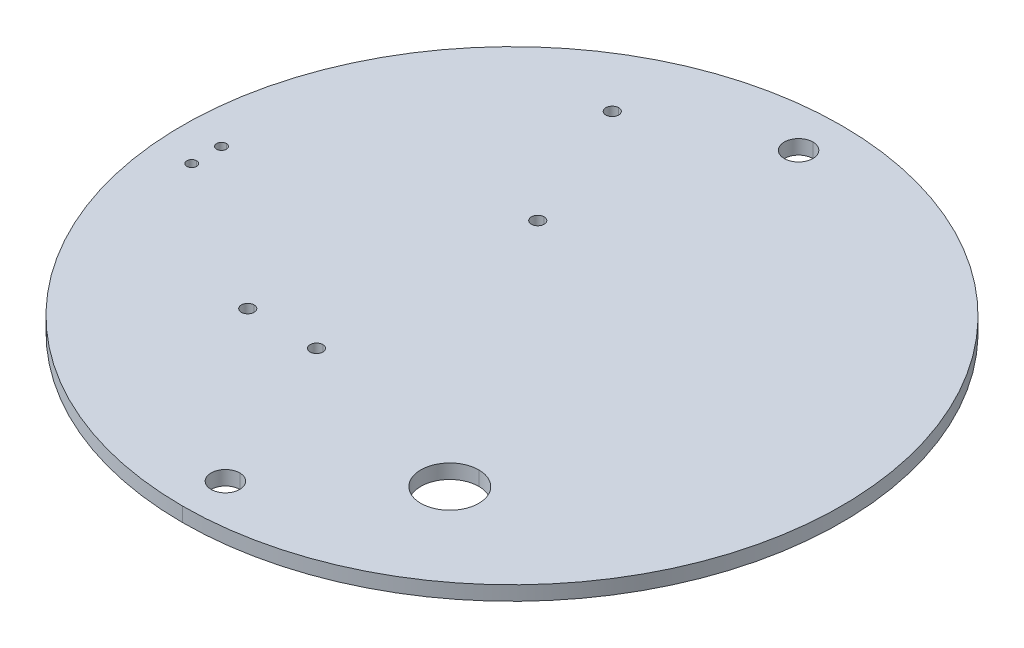
ISO-10303-21;
HEADER;
FILE_DESCRIPTION(('STEP AP214'),'2;1');
FILE_NAME('part.step','',(''),(''),'','','');
FILE_SCHEMA(('AUTOMOTIVE_DESIGN { 1 0 10303 214 1 1 1 1 }'));
ENDSEC;
DATA;
#1=APPLICATION_CONTEXT('core data for automotive mechanical design processes');
#2=APPLICATION_PROTOCOL_DEFINITION('international standard','automotive_design',2000,#1);
#3=PRODUCT_CONTEXT('',#1,'mechanical');
#4=PRODUCT('Part','Part','',(#3));
#5=PRODUCT_RELATED_PRODUCT_CATEGORY('part','',(#4));
#6=PRODUCT_DEFINITION_FORMATION('','',#4);
#7=PRODUCT_DEFINITION_CONTEXT('part definition',#1,'design');
#8=PRODUCT_DEFINITION('design','',#6,#7);
#9=PRODUCT_DEFINITION_SHAPE('','',#8);
#10=(LENGTH_UNIT() NAMED_UNIT(*) SI_UNIT(.MILLI.,.METRE.));
#11=(NAMED_UNIT(*) PLANE_ANGLE_UNIT() SI_UNIT($,.RADIAN.));
#12=(NAMED_UNIT(*) SI_UNIT($,.STERADIAN.) SOLID_ANGLE_UNIT());
#13=UNCERTAINTY_MEASURE_WITH_UNIT(LENGTH_MEASURE(1.E-05),#10,'distance_accuracy_value','');
#14=(GEOMETRIC_REPRESENTATION_CONTEXT(3) GLOBAL_UNCERTAINTY_ASSIGNED_CONTEXT((#13)) GLOBAL_UNIT_ASSIGNED_CONTEXT((#10,
#11,#12)) REPRESENTATION_CONTEXT('',''));
#15=CARTESIAN_POINT('',(0.,0.,0.));
#16=DIRECTION('',(0.,0.,1.));
#17=DIRECTION('',(1.,0.,0.));
#18=AXIS2_PLACEMENT_3D('',#15,#16,#17);
#19=CARTESIAN_POINT('',(25.8989980793946,0.,39.6789875563172));
#20=DIRECTION('',(0.,1.,0.));
#21=DIRECTION('',(0.,0.,1.));
#22=AXIS2_PLACEMENT_3D('',#19,#20,#21);
#23=CYLINDRICAL_SURFACE('',#22,6.42264793877827);
#24=DIRECTION('',(0.,1.,0.));
#25=VECTOR('',#24,1.);
#26=CARTESIAN_POINT('',(25.8989980793946,0.,33.2563396175388));
#27=LINE('',#26,#25);
#28=CARTESIAN_POINT('',(25.8989980793946,0.,33.2563396175388));
#29=VERTEX_POINT('',#28);
#30=CARTESIAN_POINT('',(25.8989980793946,3.175,33.2563396175388));
#31=VERTEX_POINT('',#30);
#32=EDGE_CURVE('E317',#29,#31,#27,.T.);
#33=ORIENTED_EDGE('',*,*,#32,.F.);
#34=CARTESIAN_POINT('',(25.8989980793946,0.,39.6789875563172));
#35=DIRECTION('',(0.,1.,0.));
#36=DIRECTION('',(0.,0.,1.));
#37=AXIS2_PLACEMENT_3D('',#34,#35,#36);
#38=CIRCLE('',#37,6.42264793877827);
#39=CARTESIAN_POINT('',(25.8989980793946,0.,46.1016354950954));
#40=VERTEX_POINT('',#39);
#41=EDGE_CURVE('E263',#40,#29,#38,.T.);
#42=ORIENTED_EDGE('',*,*,#41,.F.);
#43=DIRECTION('',(0.,1.,0.));
#44=VECTOR('',#43,1.);
#45=CARTESIAN_POINT('',(25.8989980793946,0.,46.1016354950954));
#46=LINE('',#45,#44);
#47=CARTESIAN_POINT('',(25.8989980793946,3.175,46.1016354950954));
#48=VERTEX_POINT('',#47);
#49=EDGE_CURVE('E324',#40,#48,#46,.T.);
#50=ORIENTED_EDGE('',*,*,#49,.T.);
#51=CARTESIAN_POINT('',(25.8989980793946,3.175,39.6789875563172));
#52=DIRECTION('',(0.,1.,0.));
#53=DIRECTION('',(0.,0.,1.));
#54=AXIS2_PLACEMENT_3D('',#51,#52,#53);
#55=CIRCLE('',#54,6.42264793877827);
#56=EDGE_CURVE('E332',#48,#31,#55,.T.);
#57=ORIENTED_EDGE('',*,*,#56,.T.);
#58=EDGE_LOOP('',(#33,#42,#50,#57));
#59=FACE_BOUND('',#58,.T.);
#60=ADVANCED_FACE('F16',(#59),#23,.F.);
#61=CARTESIAN_POINT('',(-28.106531802873,0.,-50.3231506884678));
#62=DIRECTION('',(0.,1.,0.));
#63=DIRECTION('',(0.,0.,1.));
#64=AXIS2_PLACEMENT_3D('',#61,#62,#63);
#65=CYLINDRICAL_SURFACE('',#64,1.4224);
#66=DIRECTION('',(0.,1.,0.));
#67=VECTOR('',#66,1.);
#68=CARTESIAN_POINT('',(-28.106531802873,0.,-51.7455506884678));
#69=LINE('',#68,#67);
#70=CARTESIAN_POINT('',(-28.106531802873,0.,-51.7455506884678));
#71=VERTEX_POINT('',#70);
#72=CARTESIAN_POINT('',(-28.106531802873,3.175,-51.7455506884678));
#73=VERTEX_POINT('',#72);
#74=EDGE_CURVE('E348',#71,#73,#69,.T.);
#75=ORIENTED_EDGE('',*,*,#74,.F.);
#76=CARTESIAN_POINT('',(-28.106531802873,0.,-50.3231506884678));
#77=DIRECTION('',(0.,1.,0.));
#78=DIRECTION('',(0.,0.,1.));
#79=AXIS2_PLACEMENT_3D('',#76,#77,#78);
#80=CIRCLE('',#79,1.4224);
#81=CARTESIAN_POINT('',(-28.106531802873,0.,-48.9007506884678));
#82=VERTEX_POINT('',#81);
#83=EDGE_CURVE('E267',#82,#71,#80,.T.);
#84=ORIENTED_EDGE('',*,*,#83,.F.);
#85=DIRECTION('',(0.,1.,0.));
#86=VECTOR('',#85,1.);
#87=CARTESIAN_POINT('',(-28.106531802873,0.,-48.9007506884678));
#88=LINE('',#87,#86);
#89=CARTESIAN_POINT('',(-28.106531802873,3.175,-48.9007506884678));
#90=VERTEX_POINT('',#89);
#91=EDGE_CURVE('E269',#82,#90,#88,.T.);
#92=ORIENTED_EDGE('',*,*,#91,.T.);
#93=CARTESIAN_POINT('',(-28.106531802873,3.175,-50.3231506884678));
#94=DIRECTION('',(0.,1.,0.));
#95=DIRECTION('',(0.,0.,1.));
#96=AXIS2_PLACEMENT_3D('',#93,#94,#95);
#97=CIRCLE('',#96,1.4224);
#98=EDGE_CURVE('E354',#90,#73,#97,.T.);
#99=ORIENTED_EDGE('',*,*,#98,.T.);
#100=EDGE_LOOP('',(#75,#84,#92,#99));
#101=FACE_BOUND('',#100,.T.);
#102=ADVANCED_FACE('F441',(#101),#65,.F.);
#103=CARTESIAN_POINT('',(-15.4065318028729,0.,-21.1131506884678));
#104=DIRECTION('',(0.,1.,0.));
#105=DIRECTION('',(0.,0.,1.));
#106=AXIS2_PLACEMENT_3D('',#103,#104,#105);
#107=CYLINDRICAL_SURFACE('',#106,1.4224);
#108=DIRECTION('',(0.,1.,0.));
#109=VECTOR('',#108,1.);
#110=CARTESIAN_POINT('',(-15.4065318028729,0.,-22.5355506884678));
#111=LINE('',#110,#109);
#112=CARTESIAN_POINT('',(-15.4065318028729,0.,-22.5355506884678));
#113=VERTEX_POINT('',#112);
#114=CARTESIAN_POINT('',(-15.4065318028729,3.175,-22.5355506884678));
#115=VERTEX_POINT('',#114);
#116=EDGE_CURVE('E235',#113,#115,#111,.T.);
#117=ORIENTED_EDGE('',*,*,#116,.F.);
#118=CARTESIAN_POINT('',(-15.4065318028729,0.,-21.1131506884678));
#119=DIRECTION('',(0.,1.,0.));
#120=DIRECTION('',(0.,0.,1.));
#121=AXIS2_PLACEMENT_3D('',#118,#119,#120);
#122=CIRCLE('',#121,1.4224);
#123=CARTESIAN_POINT('',(-15.4065318028729,0.,-19.6907506884678));
#124=VERTEX_POINT('',#123);
#125=EDGE_CURVE('E294',#124,#113,#122,.T.);
#126=ORIENTED_EDGE('',*,*,#125,.F.);
#127=DIRECTION('',(0.,1.,0.));
#128=VECTOR('',#127,1.);
#129=CARTESIAN_POINT('',(-15.4065318028729,0.,-19.6907506884678));
#130=LINE('',#129,#128);
#131=CARTESIAN_POINT('',(-15.4065318028729,3.175,-19.6907506884678));
#132=VERTEX_POINT('',#131);
#133=EDGE_CURVE('E220',#124,#132,#130,.T.);
#134=ORIENTED_EDGE('',*,*,#133,.T.);
#135=CARTESIAN_POINT('',(-15.4065318028729,3.175,-21.1131506884678));
#136=DIRECTION('',(0.,1.,0.));
#137=DIRECTION('',(0.,0.,1.));
#138=AXIS2_PLACEMENT_3D('',#135,#136,#137);
#139=CIRCLE('',#138,1.4224);
#140=EDGE_CURVE('E203',#132,#115,#139,.T.);
#141=ORIENTED_EDGE('',*,*,#140,.T.);
#142=EDGE_LOOP('',(#117,#126,#134,#141));
#143=FACE_BOUND('',#142,.T.);
#144=ADVANCED_FACE('F765',(#143),#107,.F.);
#145=CARTESIAN_POINT('',(-15.4065318028729,0.,27.9088493115323));
#146=DIRECTION('',(0.,1.,0.));
#147=DIRECTION('',(0.,0.,1.));
#148=AXIS2_PLACEMENT_3D('',#145,#146,#147);
#149=CYLINDRICAL_SURFACE('',#148,1.4224);
#150=DIRECTION('',(0.,1.,0.));
#151=VECTOR('',#150,1.);
#152=CARTESIAN_POINT('',(-15.4065318028729,0.,26.4864493115323));
#153=LINE('',#152,#151);
#154=CARTESIAN_POINT('',(-15.4065318028729,0.,26.4864493115323));
#155=VERTEX_POINT('',#154);
#156=CARTESIAN_POINT('',(-15.4065318028729,3.175,26.4864493115323));
#157=VERTEX_POINT('',#156);
#158=EDGE_CURVE('E195',#155,#157,#153,.T.);
#159=ORIENTED_EDGE('',*,*,#158,.F.);
#160=CARTESIAN_POINT('',(-15.4065318028729,0.,27.9088493115323));
#161=DIRECTION('',(0.,1.,0.));
#162=DIRECTION('',(0.,0.,1.));
#163=AXIS2_PLACEMENT_3D('',#160,#161,#162);
#164=CIRCLE('',#163,1.4224);
#165=CARTESIAN_POINT('',(-15.4065318028729,0.,29.3312493115323));
#166=VERTEX_POINT('',#165);
#167=EDGE_CURVE('E291',#166,#155,#164,.T.);
#168=ORIENTED_EDGE('',*,*,#167,.F.);
#169=DIRECTION('',(0.,1.,0.));
#170=VECTOR('',#169,1.);
#171=CARTESIAN_POINT('',(-15.4065318028729,0.,29.3312493115323));
#172=LINE('',#171,#170);
#173=CARTESIAN_POINT('',(-15.4065318028729,3.175,29.3312493115323));
#174=VERTEX_POINT('',#173);
#175=EDGE_CURVE('E198',#166,#174,#172,.T.);
#176=ORIENTED_EDGE('',*,*,#175,.T.);
#177=CARTESIAN_POINT('',(-15.4065318028729,3.175,27.9088493115323));
#178=DIRECTION('',(0.,1.,0.));
#179=DIRECTION('',(0.,0.,1.));
#180=AXIS2_PLACEMENT_3D('',#177,#178,#179);
#181=CIRCLE('',#180,1.4224);
#182=EDGE_CURVE('E192',#174,#157,#181,.T.);
#183=ORIENTED_EDGE('',*,*,#182,.T.);
#184=EDGE_LOOP('',(#159,#168,#176,#183));
#185=FACE_BOUND('',#184,.T.);
#186=ADVANCED_FACE('F18',(#185),#149,.F.);
#187=CARTESIAN_POINT('',(-30.6465318028729,0.,27.9088493115323));
#188=DIRECTION('',(0.,1.,0.));
#189=DIRECTION('',(0.,0.,1.));
#190=AXIS2_PLACEMENT_3D('',#187,#188,#189);
#191=CYLINDRICAL_SURFACE('',#190,1.4224);
#192=DIRECTION('',(0.,1.,0.));
#193=VECTOR('',#192,1.);
#194=CARTESIAN_POINT('',(-30.6465318028729,0.,26.4864493115323));
#195=LINE('',#194,#193);
#196=CARTESIAN_POINT('',(-30.6465318028729,0.,26.4864493115323));
#197=VERTEX_POINT('',#196);
#198=CARTESIAN_POINT('',(-30.6465318028729,3.175,26.4864493115323));
#199=VERTEX_POINT('',#198);
#200=EDGE_CURVE('E358',#197,#199,#195,.T.);
#201=ORIENTED_EDGE('',*,*,#200,.F.);
#202=CARTESIAN_POINT('',(-30.6465318028729,0.,27.9088493115323));
#203=DIRECTION('',(0.,1.,0.));
#204=DIRECTION('',(0.,0.,1.));
#205=AXIS2_PLACEMENT_3D('',#202,#203,#204);
#206=CIRCLE('',#205,1.4224);
#207=CARTESIAN_POINT('',(-30.6465318028729,0.,29.3312493115323));
#208=VERTEX_POINT('',#207);
#209=EDGE_CURVE('E293',#208,#197,#206,.T.);
#210=ORIENTED_EDGE('',*,*,#209,.F.);
#211=DIRECTION('',(0.,1.,0.));
#212=VECTOR('',#211,1.);
#213=CARTESIAN_POINT('',(-30.6465318028729,0.,29.3312493115323));
#214=LINE('',#213,#212);
#215=CARTESIAN_POINT('',(-30.6465318028729,3.175,29.3312493115323));
#216=VERTEX_POINT('',#215);
#217=EDGE_CURVE('E257',#208,#216,#214,.T.);
#218=ORIENTED_EDGE('',*,*,#217,.T.);
#219=CARTESIAN_POINT('',(-30.6465318028729,3.175,27.9088493115323));
#220=DIRECTION('',(0.,1.,0.));
#221=DIRECTION('',(0.,0.,1.));
#222=AXIS2_PLACEMENT_3D('',#219,#220,#221);
#223=CIRCLE('',#222,1.4224);
#224=EDGE_CURVE('E202',#216,#199,#223,.T.);
#225=ORIENTED_EDGE('',*,*,#224,.T.);
#226=EDGE_LOOP('',(#201,#210,#218,#225));
#227=FACE_BOUND('',#226,.T.);
#228=ADVANCED_FACE('F786',(#227),#191,.F.);
#229=CARTESIAN_POINT('',(-64.676376723412,0.,-0.314808657817677));
#230=DIRECTION('',(0.,1.,0.));
#231=DIRECTION('',(0.,0.,1.));
#232=AXIS2_PLACEMENT_3D('',#229,#230,#231);
#233=CYLINDRICAL_SURFACE('',#232,1.0922);
#234=DIRECTION('',(0.,1.,0.));
#235=VECTOR('',#234,1.);
#236=CARTESIAN_POINT('',(-64.676376723412,0.,-1.40700865781768));
#237=LINE('',#236,#235);
#238=CARTESIAN_POINT('',(-64.676376723412,0.,-1.40700865781768));
#239=VERTEX_POINT('',#238);
#240=CARTESIAN_POINT('',(-64.676376723412,3.175,-1.40700865781768));
#241=VERTEX_POINT('',#240);
#242=EDGE_CURVE('E306',#239,#241,#237,.T.);
#243=ORIENTED_EDGE('',*,*,#242,.F.);
#244=CARTESIAN_POINT('',(-64.676376723412,0.,-0.314808657817677));
#245=DIRECTION('',(0.,1.,0.));
#246=DIRECTION('',(0.,0.,1.));
#247=AXIS2_PLACEMENT_3D('',#244,#245,#246);
#248=CIRCLE('',#247,1.0922);
#249=CARTESIAN_POINT('',(-64.676376723412,0.,0.777391342182322));
#250=VERTEX_POINT('',#249);
#251=EDGE_CURVE('E312',#250,#239,#248,.T.);
#252=ORIENTED_EDGE('',*,*,#251,.F.);
#253=DIRECTION('',(0.,1.,0.));
#254=VECTOR('',#253,1.);
#255=CARTESIAN_POINT('',(-64.676376723412,0.,0.777391342182322));
#256=LINE('',#255,#254);
#257=CARTESIAN_POINT('',(-64.676376723412,3.175,0.777391342182322));
#258=VERTEX_POINT('',#257);
#259=EDGE_CURVE('E281',#250,#258,#256,.T.);
#260=ORIENTED_EDGE('',*,*,#259,.T.);
#261=CARTESIAN_POINT('',(-64.676376723412,3.175,-0.314808657817677));
#262=DIRECTION('',(0.,1.,0.));
#263=DIRECTION('',(0.,0.,1.));
#264=AXIS2_PLACEMENT_3D('',#261,#262,#263);
#265=CIRCLE('',#264,1.0922);
#266=EDGE_CURVE('E277',#258,#241,#265,.T.);
#267=ORIENTED_EDGE('',*,*,#266,.T.);
#268=EDGE_LOOP('',(#243,#252,#260,#267));
#269=FACE_BOUND('',#268,.T.);
#270=ADVANCED_FACE('F421',(#269),#233,.F.);
#271=CARTESIAN_POINT('',(-64.676376723412,0.,6.28919134218232));
#272=DIRECTION('',(0.,1.,0.));
#273=DIRECTION('',(0.,0.,1.));
#274=AXIS2_PLACEMENT_3D('',#271,#272,#273);
#275=CYLINDRICAL_SURFACE('',#274,1.0922);
#276=DIRECTION('',(0.,1.,0.));
#277=VECTOR('',#276,1.);
#278=CARTESIAN_POINT('',(-64.676376723412,0.,5.19699134218232));
#279=LINE('',#278,#277);
#280=CARTESIAN_POINT('',(-64.676376723412,0.,5.19699134218232));
#281=VERTEX_POINT('',#280);
#282=CARTESIAN_POINT('',(-64.676376723412,3.175,5.19699134218232));
#283=VERTEX_POINT('',#282);
#284=EDGE_CURVE('E245',#281,#283,#279,.T.);
#285=ORIENTED_EDGE('',*,*,#284,.F.);
#286=CARTESIAN_POINT('',(-64.676376723412,0.,6.28919134218232));
#287=DIRECTION('',(0.,1.,0.));
#288=DIRECTION('',(0.,0.,1.));
#289=AXIS2_PLACEMENT_3D('',#286,#287,#288);
#290=CIRCLE('',#289,1.0922);
#291=CARTESIAN_POINT('',(-64.676376723412,0.,7.38139134218232));
#292=VERTEX_POINT('',#291);
#293=EDGE_CURVE('E244',#292,#281,#290,.T.);
#294=ORIENTED_EDGE('',*,*,#293,.F.);
#295=DIRECTION('',(0.,1.,0.));
#296=VECTOR('',#295,1.);
#297=CARTESIAN_POINT('',(-64.676376723412,0.,7.38139134218232));
#298=LINE('',#297,#296);
#299=CARTESIAN_POINT('',(-64.676376723412,3.175,7.38139134218232));
#300=VERTEX_POINT('',#299);
#301=EDGE_CURVE('E256',#292,#300,#298,.T.);
#302=ORIENTED_EDGE('',*,*,#301,.T.);
#303=CARTESIAN_POINT('',(-64.676376723412,3.175,6.28919134218232));
#304=DIRECTION('',(0.,1.,0.));
#305=DIRECTION('',(0.,0.,1.));
#306=AXIS2_PLACEMENT_3D('',#303,#304,#305);
#307=CIRCLE('',#306,1.0922);
#308=EDGE_CURVE('E282',#300,#283,#307,.T.);
#309=ORIENTED_EDGE('',*,*,#308,.T.);
#310=EDGE_LOOP('',(#285,#294,#302,#309));
#311=FACE_BOUND('',#310,.T.);
#312=ADVANCED_FACE('F778',(#311),#275,.F.);
#313=CARTESIAN_POINT('',(0.,0.,63.5));
#314=DIRECTION('',(0.,1.,0.));
#315=DIRECTION('',(0.,0.,1.));
#316=AXIS2_PLACEMENT_3D('',#313,#314,#315);
#317=CYLINDRICAL_SURFACE('',#316,3.175);
#318=DIRECTION('',(0.,1.,0.));
#319=VECTOR('',#318,1.);
#320=CARTESIAN_POINT('',(0.,0.,60.325));
#321=LINE('',#320,#319);
#322=CARTESIAN_POINT('',(0.,0.,60.325));
#323=VERTEX_POINT('',#322);
#324=CARTESIAN_POINT('',(0.,3.175,60.325));
#325=VERTEX_POINT('',#324);
#326=EDGE_CURVE('E255',#323,#325,#321,.T.);
#327=ORIENTED_EDGE('',*,*,#326,.F.);
#328=CARTESIAN_POINT('',(0.,0.,63.5));
#329=DIRECTION('',(0.,1.,0.));
#330=DIRECTION('',(0.,0.,1.));
#331=AXIS2_PLACEMENT_3D('',#328,#329,#330);
#332=CIRCLE('',#331,3.175);
#333=CARTESIAN_POINT('',(0.,0.,66.675));
#334=VERTEX_POINT('',#333);
#335=EDGE_CURVE('E27',#334,#323,#332,.T.);
#336=ORIENTED_EDGE('',*,*,#335,.F.);
#337=DIRECTION('',(0.,1.,0.));
#338=VECTOR('',#337,1.);
#339=CARTESIAN_POINT('',(0.,0.,66.675));
#340=LINE('',#339,#338);
#341=CARTESIAN_POINT('',(0.,3.175,66.675));
#342=VERTEX_POINT('',#341);
#343=EDGE_CURVE('E20',#334,#342,#340,.T.);
#344=ORIENTED_EDGE('',*,*,#343,.T.);
#345=CARTESIAN_POINT('',(0.,3.175,63.5));
#346=DIRECTION('',(0.,1.,0.));
#347=DIRECTION('',(0.,0.,1.));
#348=AXIS2_PLACEMENT_3D('',#345,#346,#347);
#349=CIRCLE('',#348,3.175);
#350=EDGE_CURVE('E285',#342,#325,#349,.T.);
#351=ORIENTED_EDGE('',*,*,#350,.T.);
#352=EDGE_LOOP('',(#327,#336,#344,#351));
#353=FACE_BOUND('',#352,.T.);
#354=ADVANCED_FACE('F774',(#353),#317,.F.);
#355=CARTESIAN_POINT('',(4.43418130033078E-13,0.,-63.5));
#356=DIRECTION('',(0.,1.,0.));
#357=DIRECTION('',(0.,0.,1.));
#358=AXIS2_PLACEMENT_3D('',#355,#356,#357);
#359=CYLINDRICAL_SURFACE('',#358,3.175);
#360=DIRECTION('',(0.,1.,0.));
#361=VECTOR('',#360,1.);
#362=CARTESIAN_POINT('',(4.43806955391807E-13,0.,-66.675));
#363=LINE('',#362,#361);
#364=CARTESIAN_POINT('',(4.43806955391807E-13,0.,-66.675));
#365=VERTEX_POINT('',#364);
#366=CARTESIAN_POINT('',(4.43806955391807E-13,3.175,-66.675));
#367=VERTEX_POINT('',#366);
#368=EDGE_CURVE('E229',#365,#367,#363,.T.);
#369=ORIENTED_EDGE('',*,*,#368,.F.);
#370=CARTESIAN_POINT('',(4.43418130033078E-13,0.,-63.5));
#371=DIRECTION('',(0.,1.,0.));
#372=DIRECTION('',(0.,0.,1.));
#373=AXIS2_PLACEMENT_3D('',#370,#371,#372);
#374=CIRCLE('',#373,3.175);
#375=CARTESIAN_POINT('',(4.43418130033078E-13,0.,-60.325));
#376=VERTEX_POINT('',#375);
#377=EDGE_CURVE('E11',#376,#365,#374,.T.);
#378=ORIENTED_EDGE('',*,*,#377,.F.);
#379=DIRECTION('',(0.,1.,0.));
#380=VECTOR('',#379,1.);
#381=CARTESIAN_POINT('',(4.43418130033078E-13,0.,-60.325));
#382=LINE('',#381,#380);
#383=CARTESIAN_POINT('',(4.43418130033078E-13,3.175,-60.325));
#384=VERTEX_POINT('',#383);
#385=EDGE_CURVE('E290',#376,#384,#382,.T.);
#386=ORIENTED_EDGE('',*,*,#385,.T.);
#387=CARTESIAN_POINT('',(4.43418130033078E-13,3.175,-63.5));
#388=DIRECTION('',(0.,1.,0.));
#389=DIRECTION('',(0.,0.,1.));
#390=AXIS2_PLACEMENT_3D('',#387,#388,#389);
#391=CIRCLE('',#390,3.175);
#392=EDGE_CURVE('E268',#384,#367,#391,.T.);
#393=ORIENTED_EDGE('',*,*,#392,.T.);
#394=EDGE_LOOP('',(#369,#378,#386,#393));
#395=FACE_BOUND('',#394,.T.);
#396=ADVANCED_FACE('F717',(#395),#359,.F.);
#397=CARTESIAN_POINT('',(0.,0.,0.));
#398=DIRECTION('',(0.,1.,0.));
#399=DIRECTION('',(1.,0.,0.));
#400=AXIS2_PLACEMENT_3D('',#397,#398,#399);
#401=PLANE('',#400);
#402=ORIENTED_EDGE('',*,*,#377,.T.);
#403=CARTESIAN_POINT('',(4.43418130033078E-13,0.,-63.5));
#404=DIRECTION('',(0.,1.,0.));
#405=DIRECTION('',(0.,0.,1.));
#406=AXIS2_PLACEMENT_3D('',#403,#404,#405);
#407=CIRCLE('',#406,3.175);
#408=EDGE_CURVE('E226',#365,#376,#407,.T.);
#409=ORIENTED_EDGE('',*,*,#408,.T.);
#410=EDGE_LOOP('',(#402,#409));
#411=FACE_BOUND('',#410,.T.);
#412=ORIENTED_EDGE('',*,*,#335,.T.);
#413=CARTESIAN_POINT('',(0.,0.,63.5));
#414=DIRECTION('',(0.,1.,0.));
#415=DIRECTION('',(0.,0.,1.));
#416=AXIS2_PLACEMENT_3D('',#413,#414,#415);
#417=CIRCLE('',#416,3.175);
#418=EDGE_CURVE('E251',#323,#334,#417,.T.);
#419=ORIENTED_EDGE('',*,*,#418,.T.);
#420=EDGE_LOOP('',(#412,#419));
#421=FACE_BOUND('',#420,.T.);
#422=ORIENTED_EDGE('',*,*,#293,.T.);
#423=CARTESIAN_POINT('',(-64.676376723412,0.,6.28919134218232));
#424=DIRECTION('',(0.,1.,0.));
#425=DIRECTION('',(0.,0.,1.));
#426=AXIS2_PLACEMENT_3D('',#423,#424,#425);
#427=CIRCLE('',#426,1.0922);
#428=EDGE_CURVE('E250',#281,#292,#427,.T.);
#429=ORIENTED_EDGE('',*,*,#428,.T.);
#430=EDGE_LOOP('',(#422,#429));
#431=FACE_BOUND('',#430,.T.);
#432=ORIENTED_EDGE('',*,*,#251,.T.);
#433=CARTESIAN_POINT('',(-64.676376723412,0.,-0.314808657817677));
#434=DIRECTION('',(0.,1.,0.));
#435=DIRECTION('',(0.,0.,1.));
#436=AXIS2_PLACEMENT_3D('',#433,#434,#435);
#437=CIRCLE('',#436,1.0922);
#438=EDGE_CURVE('E261',#239,#250,#437,.T.);
#439=ORIENTED_EDGE('',*,*,#438,.T.);
#440=EDGE_LOOP('',(#432,#439));
#441=FACE_BOUND('',#440,.T.);
#442=ORIENTED_EDGE('',*,*,#209,.T.);
#443=CARTESIAN_POINT('',(-30.6465318028729,0.,27.9088493115323));
#444=DIRECTION('',(0.,1.,0.));
#445=DIRECTION('',(0.,0.,1.));
#446=AXIS2_PLACEMENT_3D('',#443,#444,#445);
#447=CIRCLE('',#446,1.4224);
#448=EDGE_CURVE('E298',#197,#208,#447,.T.);
#449=ORIENTED_EDGE('',*,*,#448,.T.);
#450=EDGE_LOOP('',(#442,#449));
#451=FACE_BOUND('',#450,.T.);
#452=ORIENTED_EDGE('',*,*,#167,.T.);
#453=CARTESIAN_POINT('',(-15.4065318028729,0.,27.9088493115323));
#454=DIRECTION('',(0.,1.,0.));
#455=DIRECTION('',(0.,0.,1.));
#456=AXIS2_PLACEMENT_3D('',#453,#454,#455);
#457=CIRCLE('',#456,1.4224);
#458=EDGE_CURVE('E213',#155,#166,#457,.T.);
#459=ORIENTED_EDGE('',*,*,#458,.T.);
#460=EDGE_LOOP('',(#452,#459));
#461=FACE_BOUND('',#460,.T.);
#462=ORIENTED_EDGE('',*,*,#125,.T.);
#463=CARTESIAN_POINT('',(-15.4065318028729,0.,-21.1131506884678));
#464=DIRECTION('',(0.,1.,0.));
#465=DIRECTION('',(0.,0.,1.));
#466=AXIS2_PLACEMENT_3D('',#463,#464,#465);
#467=CIRCLE('',#466,1.4224);
#468=EDGE_CURVE('E273',#113,#124,#467,.T.);
#469=ORIENTED_EDGE('',*,*,#468,.T.);
#470=EDGE_LOOP('',(#462,#469));
#471=FACE_BOUND('',#470,.T.);
#472=ORIENTED_EDGE('',*,*,#83,.T.);
#473=CARTESIAN_POINT('',(-28.106531802873,0.,-50.3231506884678));
#474=DIRECTION('',(0.,1.,0.));
#475=DIRECTION('',(0.,0.,1.));
#476=AXIS2_PLACEMENT_3D('',#473,#474,#475);
#477=CIRCLE('',#476,1.4224);
#478=EDGE_CURVE('E224',#71,#82,#477,.T.);
#479=ORIENTED_EDGE('',*,*,#478,.T.);
#480=EDGE_LOOP('',(#472,#479));
#481=FACE_BOUND('',#480,.T.);
#482=ORIENTED_EDGE('',*,*,#41,.T.);
#483=CARTESIAN_POINT('',(25.8989980793946,0.,39.6789875563172));
#484=DIRECTION('',(0.,1.,0.));
#485=DIRECTION('',(0.,0.,1.));
#486=AXIS2_PLACEMENT_3D('',#483,#484,#485);
#487=CIRCLE('',#486,6.42264793877827);
#488=EDGE_CURVE('E313',#29,#40,#487,.T.);
#489=ORIENTED_EDGE('',*,*,#488,.T.);
#490=EDGE_LOOP('',(#482,#489));
#491=FACE_BOUND('',#490,.T.);
#492=CARTESIAN_POINT('',(0.,0.,0.));
#493=DIRECTION('',(0.,1.,0.));
#494=DIRECTION('',(0.,0.,1.));
#495=AXIS2_PLACEMENT_3D('',#492,#493,#494);
#496=CIRCLE('',#495,73.025);
#497=CARTESIAN_POINT('',(0.,0.,-73.025));
#498=VERTEX_POINT('',#497);
#499=CARTESIAN_POINT('',(0.,0.,73.025));
#500=VERTEX_POINT('',#499);
#501=EDGE_CURVE('E41',#498,#500,#496,.T.);
#502=ORIENTED_EDGE('',*,*,#501,.F.);
#503=CARTESIAN_POINT('',(0.,0.,0.));
#504=DIRECTION('',(0.,1.,0.));
#505=DIRECTION('',(0.,0.,1.));
#506=AXIS2_PLACEMENT_3D('',#503,#504,#505);
#507=CIRCLE('',#506,73.025);
#508=EDGE_CURVE('E236',#500,#498,#507,.T.);
#509=ORIENTED_EDGE('',*,*,#508,.F.);
#510=EDGE_LOOP('',(#502,#509));
#511=FACE_BOUND('',#510,.T.);
#512=ADVANCED_FACE('F720',(#411,#421,#431,#441,#451,#461,#471,#481,#491,#511),#401,.F.);
#513=CARTESIAN_POINT('',(0.,3.175,0.));
#514=DIRECTION('',(0.,1.,0.));
#515=DIRECTION('',(1.,0.,0.));
#516=AXIS2_PLACEMENT_3D('',#513,#514,#515);
#517=PLANE('',#516);
#518=ORIENTED_EDGE('',*,*,#392,.F.);
#519=CARTESIAN_POINT('',(4.43418130033078E-13,3.175,-63.5));
#520=DIRECTION('',(0.,1.,0.));
#521=DIRECTION('',(0.,0.,1.));
#522=AXIS2_PLACEMENT_3D('',#519,#520,#521);
#523=CIRCLE('',#522,3.175);
#524=EDGE_CURVE('E429',#367,#384,#523,.T.);
#525=ORIENTED_EDGE('',*,*,#524,.F.);
#526=EDGE_LOOP('',(#518,#525));
#527=FACE_BOUND('',#526,.T.);
#528=ORIENTED_EDGE('',*,*,#350,.F.);
#529=CARTESIAN_POINT('',(0.,3.175,63.5));
#530=DIRECTION('',(0.,1.,0.));
#531=DIRECTION('',(0.,0.,1.));
#532=AXIS2_PLACEMENT_3D('',#529,#530,#531);
#533=CIRCLE('',#532,3.175);
#534=EDGE_CURVE('E365',#325,#342,#533,.T.);
#535=ORIENTED_EDGE('',*,*,#534,.F.);
#536=EDGE_LOOP('',(#528,#535));
#537=FACE_BOUND('',#536,.T.);
#538=ORIENTED_EDGE('',*,*,#308,.F.);
#539=CARTESIAN_POINT('',(-64.676376723412,3.175,6.28919134218232));
#540=DIRECTION('',(0.,1.,0.));
#541=DIRECTION('',(0.,0.,1.));
#542=AXIS2_PLACEMENT_3D('',#539,#540,#541);
#543=CIRCLE('',#542,1.0922);
#544=EDGE_CURVE('E249',#283,#300,#543,.T.);
#545=ORIENTED_EDGE('',*,*,#544,.F.);
#546=EDGE_LOOP('',(#538,#545));
#547=FACE_BOUND('',#546,.T.);
#548=ORIENTED_EDGE('',*,*,#266,.F.);
#549=CARTESIAN_POINT('',(-64.676376723412,3.175,-0.314808657817677));
#550=DIRECTION('',(0.,1.,0.));
#551=DIRECTION('',(0.,0.,1.));
#552=AXIS2_PLACEMENT_3D('',#549,#550,#551);
#553=CIRCLE('',#552,1.0922);
#554=EDGE_CURVE('E302',#241,#258,#553,.T.);
#555=ORIENTED_EDGE('',*,*,#554,.F.);
#556=EDGE_LOOP('',(#548,#555));
#557=FACE_BOUND('',#556,.T.);
#558=ORIENTED_EDGE('',*,*,#224,.F.);
#559=CARTESIAN_POINT('',(-30.6465318028729,3.175,27.9088493115323));
#560=DIRECTION('',(0.,1.,0.));
#561=DIRECTION('',(0.,0.,1.));
#562=AXIS2_PLACEMENT_3D('',#559,#560,#561);
#563=CIRCLE('',#562,1.4224);
#564=EDGE_CURVE('E262',#199,#216,#563,.T.);
#565=ORIENTED_EDGE('',*,*,#564,.F.);
#566=EDGE_LOOP('',(#558,#565));
#567=FACE_BOUND('',#566,.T.);
#568=ORIENTED_EDGE('',*,*,#182,.F.);
#569=CARTESIAN_POINT('',(-15.4065318028729,3.175,27.9088493115323));
#570=DIRECTION('',(0.,1.,0.));
#571=DIRECTION('',(0.,0.,1.));
#572=AXIS2_PLACEMENT_3D('',#569,#570,#571);
#573=CIRCLE('',#572,1.4224);
#574=EDGE_CURVE('E205',#157,#174,#573,.T.);
#575=ORIENTED_EDGE('',*,*,#574,.F.);
#576=EDGE_LOOP('',(#568,#575));
#577=FACE_BOUND('',#576,.T.);
#578=ORIENTED_EDGE('',*,*,#140,.F.);
#579=CARTESIAN_POINT('',(-15.4065318028729,3.175,-21.1131506884678));
#580=DIRECTION('',(0.,1.,0.));
#581=DIRECTION('',(0.,0.,1.));
#582=AXIS2_PLACEMENT_3D('',#579,#580,#581);
#583=CIRCLE('',#582,1.4224);
#584=EDGE_CURVE('E231',#115,#132,#583,.T.);
#585=ORIENTED_EDGE('',*,*,#584,.F.);
#586=EDGE_LOOP('',(#578,#585));
#587=FACE_BOUND('',#586,.T.);
#588=ORIENTED_EDGE('',*,*,#98,.F.);
#589=CARTESIAN_POINT('',(-28.106531802873,3.175,-50.3231506884678));
#590=DIRECTION('',(0.,1.,0.));
#591=DIRECTION('',(0.,0.,1.));
#592=AXIS2_PLACEMENT_3D('',#589,#590,#591);
#593=CIRCLE('',#592,1.4224);
#594=EDGE_CURVE('E274',#73,#90,#593,.T.);
#595=ORIENTED_EDGE('',*,*,#594,.F.);
#596=EDGE_LOOP('',(#588,#595));
#597=FACE_BOUND('',#596,.T.);
#598=ORIENTED_EDGE('',*,*,#56,.F.);
#599=CARTESIAN_POINT('',(25.8989980793946,3.175,39.6789875563172));
#600=DIRECTION('',(0.,1.,0.));
#601=DIRECTION('',(0.,0.,1.));
#602=AXIS2_PLACEMENT_3D('',#599,#600,#601);
#603=CIRCLE('',#602,6.42264793877827);
#604=EDGE_CURVE('E321',#31,#48,#603,.T.);
#605=ORIENTED_EDGE('',*,*,#604,.F.);
#606=EDGE_LOOP('',(#598,#605));
#607=FACE_BOUND('',#606,.T.);
#608=CARTESIAN_POINT('',(0.,3.175,0.));
#609=DIRECTION('',(0.,1.,0.));
#610=DIRECTION('',(0.,0.,1.));
#611=AXIS2_PLACEMENT_3D('',#608,#609,#610);
#612=CIRCLE('',#611,73.025);
#613=CARTESIAN_POINT('',(0.,3.175,-73.025));
#614=VERTEX_POINT('',#613);
#615=CARTESIAN_POINT('',(0.,3.175,73.025));
#616=VERTEX_POINT('',#615);
#617=EDGE_CURVE('E303',#614,#616,#612,.T.);
#618=ORIENTED_EDGE('',*,*,#617,.T.);
#619=CARTESIAN_POINT('',(0.,3.175,0.));
#620=DIRECTION('',(0.,1.,0.));
#621=DIRECTION('',(0.,0.,1.));
#622=AXIS2_PLACEMENT_3D('',#619,#620,#621);
#623=CIRCLE('',#622,73.025);
#624=EDGE_CURVE('E286',#616,#614,#623,.T.);
#625=ORIENTED_EDGE('',*,*,#624,.T.);
#626=EDGE_LOOP('',(#618,#625));
#627=FACE_BOUND('',#626,.T.);
#628=ADVANCED_FACE('F206',(#527,#537,#547,#557,#567,#577,#587,#597,#607,#627),#517,.T.);
#629=CARTESIAN_POINT('',(0.,3.175,0.));
#630=DIRECTION('',(0.,-1.,0.));
#631=DIRECTION('',(0.,0.,-1.));
#632=AXIS2_PLACEMENT_3D('',#629,#630,#631);
#633=CYLINDRICAL_SURFACE('',#632,73.025);
#634=DIRECTION('',(0.,-1.,0.));
#635=VECTOR('',#634,1.);
#636=CARTESIAN_POINT('',(0.,3.175,73.025));
#637=LINE('',#636,#635);
#638=EDGE_CURVE('E241',#616,#500,#637,.T.);
#639=ORIENTED_EDGE('',*,*,#638,.F.);
#640=ORIENTED_EDGE('',*,*,#617,.F.);
#641=DIRECTION('',(0.,-1.,0.));
#642=VECTOR('',#641,1.);
#643=CARTESIAN_POINT('',(0.,3.175,-73.025));
#644=LINE('',#643,#642);
#645=EDGE_CURVE('E240',#614,#498,#644,.T.);
#646=ORIENTED_EDGE('',*,*,#645,.T.);
#647=ORIENTED_EDGE('',*,*,#501,.T.);
#648=EDGE_LOOP('',(#639,#640,#646,#647));
#649=FACE_BOUND('',#648,.T.);
#650=ADVANCED_FACE('F740',(#649),#633,.T.);
#651=CARTESIAN_POINT('',(0.,3.175,0.));
#652=DIRECTION('',(0.,-1.,0.));
#653=DIRECTION('',(0.,0.,-1.));
#654=AXIS2_PLACEMENT_3D('',#651,#652,#653);
#655=CYLINDRICAL_SURFACE('',#654,73.025);
#656=ORIENTED_EDGE('',*,*,#624,.F.);
#657=ORIENTED_EDGE('',*,*,#638,.T.);
#658=ORIENTED_EDGE('',*,*,#508,.T.);
#659=ORIENTED_EDGE('',*,*,#645,.F.);
#660=EDGE_LOOP('',(#656,#657,#658,#659));
#661=FACE_BOUND('',#660,.T.);
#662=ADVANCED_FACE('F747',(#661),#655,.T.);
#663=CARTESIAN_POINT('',(4.43418130033078E-13,0.,-63.5));
#664=DIRECTION('',(0.,1.,0.));
#665=DIRECTION('',(0.,0.,1.));
#666=AXIS2_PLACEMENT_3D('',#663,#664,#665);
#667=CYLINDRICAL_SURFACE('',#666,3.175);
#668=ORIENTED_EDGE('',*,*,#408,.F.);
#669=ORIENTED_EDGE('',*,*,#368,.T.);
#670=ORIENTED_EDGE('',*,*,#524,.T.);
#671=ORIENTED_EDGE('',*,*,#385,.F.);
#672=EDGE_LOOP('',(#668,#669,#670,#671));
#673=FACE_BOUND('',#672,.T.);
#674=ADVANCED_FACE('F711',(#673),#667,.F.);
#675=CARTESIAN_POINT('',(0.,0.,63.5));
#676=DIRECTION('',(0.,1.,0.));
#677=DIRECTION('',(0.,0.,1.));
#678=AXIS2_PLACEMENT_3D('',#675,#676,#677);
#679=CYLINDRICAL_SURFACE('',#678,3.175);
#680=ORIENTED_EDGE('',*,*,#418,.F.);
#681=ORIENTED_EDGE('',*,*,#326,.T.);
#682=ORIENTED_EDGE('',*,*,#534,.T.);
#683=ORIENTED_EDGE('',*,*,#343,.F.);
#684=EDGE_LOOP('',(#680,#681,#682,#683));
#685=FACE_BOUND('',#684,.T.);
#686=ADVANCED_FACE('F755',(#685),#679,.F.);
#687=CARTESIAN_POINT('',(-64.676376723412,0.,6.28919134218232));
#688=DIRECTION('',(0.,1.,0.));
#689=DIRECTION('',(0.,0.,1.));
#690=AXIS2_PLACEMENT_3D('',#687,#688,#689);
#691=CYLINDRICAL_SURFACE('',#690,1.0922);
#692=ORIENTED_EDGE('',*,*,#428,.F.);
#693=ORIENTED_EDGE('',*,*,#284,.T.);
#694=ORIENTED_EDGE('',*,*,#544,.T.);
#695=ORIENTED_EDGE('',*,*,#301,.F.);
#696=EDGE_LOOP('',(#692,#693,#694,#695));
#697=FACE_BOUND('',#696,.T.);
#698=ADVANCED_FACE('F805',(#697),#691,.F.);
#699=CARTESIAN_POINT('',(-64.676376723412,0.,-0.314808657817677));
#700=DIRECTION('',(0.,1.,0.));
#701=DIRECTION('',(0.,0.,1.));
#702=AXIS2_PLACEMENT_3D('',#699,#700,#701);
#703=CYLINDRICAL_SURFACE('',#702,1.0922);
#704=ORIENTED_EDGE('',*,*,#438,.F.);
#705=ORIENTED_EDGE('',*,*,#242,.T.);
#706=ORIENTED_EDGE('',*,*,#554,.T.);
#707=ORIENTED_EDGE('',*,*,#259,.F.);
#708=EDGE_LOOP('',(#704,#705,#706,#707));
#709=FACE_BOUND('',#708,.T.);
#710=ADVANCED_FACE('F416',(#709),#703,.F.);
#711=CARTESIAN_POINT('',(-30.6465318028729,0.,27.9088493115323));
#712=DIRECTION('',(0.,1.,0.));
#713=DIRECTION('',(0.,0.,1.));
#714=AXIS2_PLACEMENT_3D('',#711,#712,#713);
#715=CYLINDRICAL_SURFACE('',#714,1.4224);
#716=ORIENTED_EDGE('',*,*,#448,.F.);
#717=ORIENTED_EDGE('',*,*,#200,.T.);
#718=ORIENTED_EDGE('',*,*,#564,.T.);
#719=ORIENTED_EDGE('',*,*,#217,.F.);
#720=EDGE_LOOP('',(#716,#717,#718,#719));
#721=FACE_BOUND('',#720,.T.);
#722=ADVANCED_FACE('F798',(#721),#715,.F.);
#723=CARTESIAN_POINT('',(-15.4065318028729,0.,27.9088493115323));
#724=DIRECTION('',(0.,1.,0.));
#725=DIRECTION('',(0.,0.,1.));
#726=AXIS2_PLACEMENT_3D('',#723,#724,#725);
#727=CYLINDRICAL_SURFACE('',#726,1.4224);
#728=ORIENTED_EDGE('',*,*,#458,.F.);
#729=ORIENTED_EDGE('',*,*,#158,.T.);
#730=ORIENTED_EDGE('',*,*,#574,.T.);
#731=ORIENTED_EDGE('',*,*,#175,.F.);
#732=EDGE_LOOP('',(#728,#729,#730,#731));
#733=FACE_BOUND('',#732,.T.);
#734=ADVANCED_FACE('F211',(#733),#727,.F.);
#735=CARTESIAN_POINT('',(-15.4065318028729,0.,-21.1131506884678));
#736=DIRECTION('',(0.,1.,0.));
#737=DIRECTION('',(0.,0.,1.));
#738=AXIS2_PLACEMENT_3D('',#735,#736,#737);
#739=CYLINDRICAL_SURFACE('',#738,1.4224);
#740=ORIENTED_EDGE('',*,*,#468,.F.);
#741=ORIENTED_EDGE('',*,*,#116,.T.);
#742=ORIENTED_EDGE('',*,*,#584,.T.);
#743=ORIENTED_EDGE('',*,*,#133,.F.);
#744=EDGE_LOOP('',(#740,#741,#742,#743));
#745=FACE_BOUND('',#744,.T.);
#746=ADVANCED_FACE('F772',(#745),#739,.F.);
#747=CARTESIAN_POINT('',(-28.106531802873,0.,-50.3231506884678));
#748=DIRECTION('',(0.,1.,0.));
#749=DIRECTION('',(0.,0.,1.));
#750=AXIS2_PLACEMENT_3D('',#747,#748,#749);
#751=CYLINDRICAL_SURFACE('',#750,1.4224);
#752=ORIENTED_EDGE('',*,*,#478,.F.);
#753=ORIENTED_EDGE('',*,*,#74,.T.);
#754=ORIENTED_EDGE('',*,*,#594,.T.);
#755=ORIENTED_EDGE('',*,*,#91,.F.);
#756=EDGE_LOOP('',(#752,#753,#754,#755));
#757=FACE_BOUND('',#756,.T.);
#758=ADVANCED_FACE('F447',(#757),#751,.F.);
#759=CARTESIAN_POINT('',(25.8989980793946,0.,39.6789875563172));
#760=DIRECTION('',(0.,1.,0.));
#761=DIRECTION('',(0.,0.,1.));
#762=AXIS2_PLACEMENT_3D('',#759,#760,#761);
#763=CYLINDRICAL_SURFACE('',#762,6.42264793877827);
#764=ORIENTED_EDGE('',*,*,#488,.F.);
#765=ORIENTED_EDGE('',*,*,#32,.T.);
#766=ORIENTED_EDGE('',*,*,#604,.T.);
#767=ORIENTED_EDGE('',*,*,#49,.F.);
#768=EDGE_LOOP('',(#764,#765,#766,#767));
#769=FACE_BOUND('',#768,.T.);
#770=ADVANCED_FACE('F737',(#769),#763,.F.);
#771=CLOSED_SHELL('',(#60,#102,#144,#186,#228,#270,#312,#354,#396,#512,#628,#650,#662,#674,#686,
#698,#710,#722,#734,#746,#758,#770));
#772=MANIFOLD_SOLID_BREP('B1',#771);
#773=ADVANCED_BREP_SHAPE_REPRESENTATION('',(#18,#772),#14);
#774=SHAPE_DEFINITION_REPRESENTATION(#9,#773);
ENDSEC;
END-ISO-10303-21;
